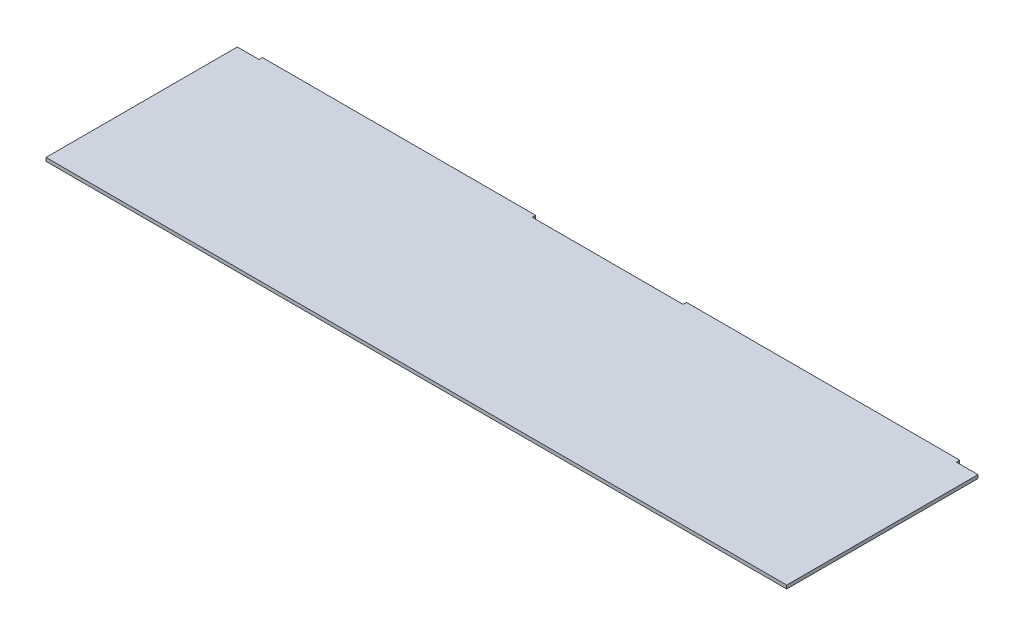
ISO-10303-21;
HEADER;
FILE_DESCRIPTION(('STEP AP214'),'2;1');
FILE_NAME('part.step','',(''),(''),'','','');
FILE_SCHEMA(('AUTOMOTIVE_DESIGN { 1 0 10303 214 1 1 1 1 }'));
ENDSEC;
DATA;
#1=APPLICATION_CONTEXT('core data for automotive mechanical design processes');
#2=APPLICATION_PROTOCOL_DEFINITION('international standard','automotive_design',2000,#1);
#3=PRODUCT_CONTEXT('',#1,'mechanical');
#4=PRODUCT('Part','Part','',(#3));
#5=PRODUCT_RELATED_PRODUCT_CATEGORY('part','',(#4));
#6=PRODUCT_DEFINITION_FORMATION('','',#4);
#7=PRODUCT_DEFINITION_CONTEXT('part definition',#1,'design');
#8=PRODUCT_DEFINITION('design','',#6,#7);
#9=PRODUCT_DEFINITION_SHAPE('','',#8);
#10=(LENGTH_UNIT() NAMED_UNIT(*) SI_UNIT(.MILLI.,.METRE.));
#11=(NAMED_UNIT(*) PLANE_ANGLE_UNIT() SI_UNIT($,.RADIAN.));
#12=(NAMED_UNIT(*) SI_UNIT($,.STERADIAN.) SOLID_ANGLE_UNIT());
#13=UNCERTAINTY_MEASURE_WITH_UNIT(LENGTH_MEASURE(1.E-05),#10,'distance_accuracy_value','');
#14=(GEOMETRIC_REPRESENTATION_CONTEXT(3) GLOBAL_UNCERTAINTY_ASSIGNED_CONTEXT((#13)) GLOBAL_UNIT_ASSIGNED_CONTEXT((#10,
#11,#12)) REPRESENTATION_CONTEXT('',''));
#15=CARTESIAN_POINT('',(0.,0.,0.));
#16=DIRECTION('',(0.,0.,1.));
#17=DIRECTION('',(1.,0.,0.));
#18=AXIS2_PLACEMENT_3D('',#15,#16,#17);
#19=CARTESIAN_POINT('',(-344.2208,1.5875,-88.9));
#20=DIRECTION('',(0.,0.,1.));
#21=DIRECTION('',(1.,0.,0.));
#22=AXIS2_PLACEMENT_3D('',#19,#20,#21);
#23=PLANE('',#22);
#24=DIRECTION('',(0.,1.,0.));
#25=VECTOR('',#24,1.);
#26=CARTESIAN_POINT('',(-324.0659,1.5875,-88.9));
#27=LINE('',#26,#25);
#28=CARTESIAN_POINT('',(-324.0659,-1.5875,-88.9));
#29=VERTEX_POINT('',#28);
#30=CARTESIAN_POINT('',(-324.0659,1.5875,-88.9));
#31=VERTEX_POINT('',#30);
#32=EDGE_CURVE('E145',#29,#31,#27,.T.);
#33=ORIENTED_EDGE('',*,*,#32,.F.);
#34=DIRECTION('',(-1.,0.,0.));
#35=VECTOR('',#34,1.);
#36=CARTESIAN_POINT('',(-344.2208,-1.5875,-88.9));
#37=LINE('',#36,#35);
#38=CARTESIAN_POINT('',(-344.2208,-1.5875,-88.9));
#39=VERTEX_POINT('',#38);
#40=EDGE_CURVE('E193',#29,#39,#37,.T.);
#41=ORIENTED_EDGE('',*,*,#40,.T.);
#42=DIRECTION('',(0.,-1.,0.));
#43=VECTOR('',#42,1.);
#44=CARTESIAN_POINT('',(-344.2208,1.5875,-88.9));
#45=LINE('',#44,#43);
#46=CARTESIAN_POINT('',(-344.2208,1.5875,-88.9));
#47=VERTEX_POINT('',#46);
#48=EDGE_CURVE('E41',#47,#39,#45,.T.);
#49=ORIENTED_EDGE('',*,*,#48,.F.);
#50=DIRECTION('',(-1.,0.,0.));
#51=VECTOR('',#50,1.);
#52=CARTESIAN_POINT('',(-344.2208,1.5875,-88.9));
#53=LINE('',#52,#51);
#54=EDGE_CURVE('E48',#31,#47,#53,.T.);
#55=ORIENTED_EDGE('',*,*,#54,.F.);
#56=EDGE_LOOP('',(#33,#41,#49,#55));
#57=FACE_BOUND('',#56,.T.);
#58=ADVANCED_FACE('F33',(#57),#23,.F.);
#59=DIRECTION('',(0.,-1.,0.));
#60=VECTOR('',#59,1.);
#61=CARTESIAN_POINT('',(-70.0658999999999,1.5875,-88.9));
#62=LINE('',#61,#60);
#63=CARTESIAN_POINT('',(-70.0658999999999,1.5875,-88.9));
#64=VERTEX_POINT('',#63);
#65=CARTESIAN_POINT('',(-70.0658999999999,-1.5875,-88.9));
#66=VERTEX_POINT('',#65);
#67=EDGE_CURVE('E56',#64,#66,#62,.T.);
#68=ORIENTED_EDGE('',*,*,#67,.F.);
#69=CARTESIAN_POINT('',(70.0658999999999,1.5875,-88.9));
#70=VERTEX_POINT('',#69);
#71=EDGE_CURVE('E186',#70,#64,#53,.T.);
#72=ORIENTED_EDGE('',*,*,#71,.F.);
#73=DIRECTION('',(0.,1.,0.));
#74=VECTOR('',#73,1.);
#75=CARTESIAN_POINT('',(70.0658999999999,1.5875,-88.9));
#76=LINE('',#75,#74);
#77=CARTESIAN_POINT('',(70.0658999999999,-1.5875,-88.9));
#78=VERTEX_POINT('',#77);
#79=EDGE_CURVE('E149',#78,#70,#76,.T.);
#80=ORIENTED_EDGE('',*,*,#79,.F.);
#81=EDGE_CURVE('E197',#78,#66,#37,.T.);
#82=ORIENTED_EDGE('',*,*,#81,.T.);
#83=EDGE_LOOP('',(#68,#72,#80,#82));
#84=FACE_BOUND('',#83,.T.);
#85=ADVANCED_FACE('F248',(#84),#23,.F.);
#86=DIRECTION('',(0.,-1.,0.));
#87=VECTOR('',#86,1.);
#88=CARTESIAN_POINT('',(324.0659,1.5875,-88.9));
#89=LINE('',#88,#87);
#90=CARTESIAN_POINT('',(324.0659,1.5875,-88.9));
#91=VERTEX_POINT('',#90);
#92=CARTESIAN_POINT('',(324.0659,-1.5875,-88.9));
#93=VERTEX_POINT('',#92);
#94=EDGE_CURVE('E146',#91,#93,#89,.T.);
#95=ORIENTED_EDGE('',*,*,#94,.F.);
#96=CARTESIAN_POINT('',(344.2208,1.5875,-88.9));
#97=VERTEX_POINT('',#96);
#98=EDGE_CURVE('E182',#97,#91,#53,.T.);
#99=ORIENTED_EDGE('',*,*,#98,.F.);
#100=DIRECTION('',(0.,-1.,0.));
#101=VECTOR('',#100,1.);
#102=CARTESIAN_POINT('',(344.2208,1.5875,-88.9));
#103=LINE('',#102,#101);
#104=CARTESIAN_POINT('',(344.2208,-1.5875,-88.9));
#105=VERTEX_POINT('',#104);
#106=EDGE_CURVE('E11',#97,#105,#103,.T.);
#107=ORIENTED_EDGE('',*,*,#106,.T.);
#108=EDGE_CURVE('E194',#105,#93,#37,.T.);
#109=ORIENTED_EDGE('',*,*,#108,.T.);
#110=EDGE_LOOP('',(#95,#99,#107,#109));
#111=FACE_BOUND('',#110,.T.);
#112=ADVANCED_FACE('F246',(#111),#23,.F.);
#113=CARTESIAN_POINT('',(344.2208,1.5875,-88.9));
#114=DIRECTION('',(-1.,0.,0.));
#115=DIRECTION('',(0.,0.,1.));
#116=AXIS2_PLACEMENT_3D('',#113,#114,#115);
#117=PLANE('',#116);
#118=DIRECTION('',(0.,0.,-1.));
#119=VECTOR('',#118,1.);
#120=CARTESIAN_POINT('',(344.2208,-1.5875,-88.9));
#121=LINE('',#120,#119);
#122=CARTESIAN_POINT('',(344.2208,-1.5875,88.9));
#123=VERTEX_POINT('',#122);
#124=EDGE_CURVE('E178',#123,#105,#121,.T.);
#125=ORIENTED_EDGE('',*,*,#124,.T.);
#126=ORIENTED_EDGE('',*,*,#106,.F.);
#127=DIRECTION('',(0.,0.,-1.));
#128=VECTOR('',#127,1.);
#129=CARTESIAN_POINT('',(344.2208,1.5875,-88.9));
#130=LINE('',#129,#128);
#131=CARTESIAN_POINT('',(344.2208,1.5875,88.9));
#132=VERTEX_POINT('',#131);
#133=EDGE_CURVE('E179',#132,#97,#130,.T.);
#134=ORIENTED_EDGE('',*,*,#133,.F.);
#135=DIRECTION('',(0.,-1.,0.));
#136=VECTOR('',#135,1.);
#137=CARTESIAN_POINT('',(344.2208,1.5875,88.9));
#138=LINE('',#137,#136);
#139=EDGE_CURVE('E190',#132,#123,#138,.T.);
#140=ORIENTED_EDGE('',*,*,#139,.T.);
#141=EDGE_LOOP('',(#125,#126,#134,#140));
#142=FACE_BOUND('',#141,.T.);
#143=ADVANCED_FACE('F35',(#142),#117,.F.);
#144=CARTESIAN_POINT('',(-344.2208,1.5875,-88.9));
#145=DIRECTION('',(1.,0.,0.));
#146=DIRECTION('',(0.,0.,-1.));
#147=AXIS2_PLACEMENT_3D('',#144,#145,#146);
#148=PLANE('',#147);
#149=DIRECTION('',(0.,0.,1.));
#150=VECTOR('',#149,1.);
#151=CARTESIAN_POINT('',(-344.2208,-1.5875,-88.9));
#152=LINE('',#151,#150);
#153=CARTESIAN_POINT('',(-344.2208,-1.5875,88.9));
#154=VERTEX_POINT('',#153);
#155=EDGE_CURVE('E196',#39,#154,#152,.T.);
#156=ORIENTED_EDGE('',*,*,#155,.T.);
#157=DIRECTION('',(0.,-1.,0.));
#158=VECTOR('',#157,1.);
#159=CARTESIAN_POINT('',(-344.2208,1.5875,88.9));
#160=LINE('',#159,#158);
#161=CARTESIAN_POINT('',(-344.2208,1.5875,88.9));
#162=VERTEX_POINT('',#161);
#163=EDGE_CURVE('E202',#162,#154,#160,.T.);
#164=ORIENTED_EDGE('',*,*,#163,.F.);
#165=DIRECTION('',(0.,0.,1.));
#166=VECTOR('',#165,1.);
#167=CARTESIAN_POINT('',(-344.2208,1.5875,-88.9));
#168=LINE('',#167,#166);
#169=EDGE_CURVE('E185',#47,#162,#168,.T.);
#170=ORIENTED_EDGE('',*,*,#169,.F.);
#171=ORIENTED_EDGE('',*,*,#48,.T.);
#172=EDGE_LOOP('',(#156,#164,#170,#171));
#173=FACE_BOUND('',#172,.T.);
#174=ADVANCED_FACE('F208',(#173),#148,.F.);
#175=CARTESIAN_POINT('',(-344.2208,1.5875,88.9));
#176=DIRECTION('',(0.,0.,-1.));
#177=DIRECTION('',(-1.,0.,0.));
#178=AXIS2_PLACEMENT_3D('',#175,#176,#177);
#179=PLANE('',#178);
#180=DIRECTION('',(1.,0.,0.));
#181=VECTOR('',#180,1.);
#182=CARTESIAN_POINT('',(-344.2208,-1.5875,88.9));
#183=LINE('',#182,#181);
#184=EDGE_CURVE('E181',#154,#123,#183,.T.);
#185=ORIENTED_EDGE('',*,*,#184,.T.);
#186=ORIENTED_EDGE('',*,*,#139,.F.);
#187=DIRECTION('',(1.,0.,0.));
#188=VECTOR('',#187,1.);
#189=CARTESIAN_POINT('',(-344.2208,1.5875,88.9));
#190=LINE('',#189,#188);
#191=EDGE_CURVE('E188',#162,#132,#190,.T.);
#192=ORIENTED_EDGE('',*,*,#191,.F.);
#193=ORIENTED_EDGE('',*,*,#163,.T.);
#194=EDGE_LOOP('',(#185,#186,#192,#193));
#195=FACE_BOUND('',#194,.T.);
#196=ADVANCED_FACE('F216',(#195),#179,.F.);
#197=CARTESIAN_POINT('',(0.,1.5875,0.));
#198=DIRECTION('',(0.,1.,0.));
#199=DIRECTION('',(0.,0.,1.));
#200=AXIS2_PLACEMENT_3D('',#197,#198,#199);
#201=PLANE('',#200);
#202=ORIENTED_EDGE('',*,*,#133,.T.);
#203=ORIENTED_EDGE('',*,*,#98,.T.);
#204=DIRECTION('',(0.,0.,1.));
#205=VECTOR('',#204,1.);
#206=CARTESIAN_POINT('',(324.0659,1.5875,-92.075));
#207=LINE('',#206,#205);
#208=CARTESIAN_POINT('',(324.0659,1.5875,-92.075));
#209=VERTEX_POINT('',#208);
#210=EDGE_CURVE('E163',#209,#91,#207,.T.);
#211=ORIENTED_EDGE('',*,*,#210,.F.);
#212=DIRECTION('',(1.,0.,0.));
#213=VECTOR('',#212,1.);
#214=CARTESIAN_POINT('',(324.0659,1.5875,-92.075));
#215=LINE('',#214,#213);
#216=CARTESIAN_POINT('',(70.0658999999999,1.5875,-92.075));
#217=VERTEX_POINT('',#216);
#218=EDGE_CURVE('E162',#217,#209,#215,.T.);
#219=ORIENTED_EDGE('',*,*,#218,.F.);
#220=DIRECTION('',(0.,0.,1.));
#221=VECTOR('',#220,1.);
#222=CARTESIAN_POINT('',(70.0658999999999,1.5875,-92.075));
#223=LINE('',#222,#221);
#224=EDGE_CURVE('E169',#217,#70,#223,.T.);
#225=ORIENTED_EDGE('',*,*,#224,.T.);
#226=ORIENTED_EDGE('',*,*,#71,.T.);
#227=DIRECTION('',(0.,0.,1.));
#228=VECTOR('',#227,1.);
#229=CARTESIAN_POINT('',(-70.0658999999999,1.5875,-92.075));
#230=LINE('',#229,#228);
#231=CARTESIAN_POINT('',(-70.0658999999999,1.5875,-92.075));
#232=VERTEX_POINT('',#231);
#233=EDGE_CURVE('E130',#232,#64,#230,.T.);
#234=ORIENTED_EDGE('',*,*,#233,.F.);
#235=DIRECTION('',(1.,0.,0.));
#236=VECTOR('',#235,1.);
#237=CARTESIAN_POINT('',(-324.0659,1.5875,-92.075));
#238=LINE('',#237,#236);
#239=CARTESIAN_POINT('',(-324.0659,1.5875,-92.075));
#240=VERTEX_POINT('',#239);
#241=EDGE_CURVE('E122',#240,#232,#238,.T.);
#242=ORIENTED_EDGE('',*,*,#241,.F.);
#243=DIRECTION('',(0.,0.,1.));
#244=VECTOR('',#243,1.);
#245=CARTESIAN_POINT('',(-324.0659,1.5875,-92.075));
#246=LINE('',#245,#244);
#247=EDGE_CURVE('E127',#240,#31,#246,.T.);
#248=ORIENTED_EDGE('',*,*,#247,.T.);
#249=ORIENTED_EDGE('',*,*,#54,.T.);
#250=ORIENTED_EDGE('',*,*,#169,.T.);
#251=ORIENTED_EDGE('',*,*,#191,.T.);
#252=EDGE_LOOP('',(#202,#203,#211,#219,#225,#226,#234,#242,#248,#249,#250,#251));
#253=FACE_BOUND('',#252,.T.);
#254=ADVANCED_FACE('F125',(#253),#201,.T.);
#255=CARTESIAN_POINT('',(0.,-1.5875,0.));
#256=DIRECTION('',(0.,1.,0.));
#257=DIRECTION('',(0.,0.,1.));
#258=AXIS2_PLACEMENT_3D('',#255,#256,#257);
#259=PLANE('',#258);
#260=ORIENTED_EDGE('',*,*,#124,.F.);
#261=ORIENTED_EDGE('',*,*,#184,.F.);
#262=ORIENTED_EDGE('',*,*,#155,.F.);
#263=ORIENTED_EDGE('',*,*,#40,.F.);
#264=DIRECTION('',(0.,0.,1.));
#265=VECTOR('',#264,1.);
#266=CARTESIAN_POINT('',(-324.0659,-1.5875,-92.075));
#267=LINE('',#266,#265);
#268=CARTESIAN_POINT('',(-324.0659,-1.5875,-92.075));
#269=VERTEX_POINT('',#268);
#270=EDGE_CURVE('E229',#269,#29,#267,.T.);
#271=ORIENTED_EDGE('',*,*,#270,.F.);
#272=DIRECTION('',(-1.,0.,0.));
#273=VECTOR('',#272,1.);
#274=CARTESIAN_POINT('',(-324.0659,-1.5875,-92.075));
#275=LINE('',#274,#273);
#276=CARTESIAN_POINT('',(-70.0658999999999,-1.5875,-92.075));
#277=VERTEX_POINT('',#276);
#278=EDGE_CURVE('E139',#277,#269,#275,.T.);
#279=ORIENTED_EDGE('',*,*,#278,.F.);
#280=DIRECTION('',(0.,0.,1.));
#281=VECTOR('',#280,1.);
#282=CARTESIAN_POINT('',(-70.0658999999999,-1.5875,-92.075));
#283=LINE('',#282,#281);
#284=EDGE_CURVE('E151',#277,#66,#283,.T.);
#285=ORIENTED_EDGE('',*,*,#284,.T.);
#286=ORIENTED_EDGE('',*,*,#81,.F.);
#287=DIRECTION('',(0.,0.,1.));
#288=VECTOR('',#287,1.);
#289=CARTESIAN_POINT('',(70.0658999999999,-1.5875,-92.075));
#290=LINE('',#289,#288);
#291=CARTESIAN_POINT('',(70.0658999999999,-1.5875,-92.075));
#292=VERTEX_POINT('',#291);
#293=EDGE_CURVE('E172',#292,#78,#290,.T.);
#294=ORIENTED_EDGE('',*,*,#293,.F.);
#295=DIRECTION('',(-1.,0.,0.));
#296=VECTOR('',#295,1.);
#297=CARTESIAN_POINT('',(324.0659,-1.5875,-92.075));
#298=LINE('',#297,#296);
#299=CARTESIAN_POINT('',(324.0659,-1.5875,-92.075));
#300=VERTEX_POINT('',#299);
#301=EDGE_CURVE('E158',#300,#292,#298,.T.);
#302=ORIENTED_EDGE('',*,*,#301,.F.);
#303=DIRECTION('',(0.,0.,1.));
#304=VECTOR('',#303,1.);
#305=CARTESIAN_POINT('',(324.0659,-1.5875,-92.075));
#306=LINE('',#305,#304);
#307=EDGE_CURVE('E175',#300,#93,#306,.T.);
#308=ORIENTED_EDGE('',*,*,#307,.T.);
#309=ORIENTED_EDGE('',*,*,#108,.F.);
#310=EDGE_LOOP('',(#260,#261,#262,#263,#271,#279,#285,#286,#294,#302,#308,#309));
#311=FACE_BOUND('',#310,.T.);
#312=ADVANCED_FACE('F213',(#311),#259,.F.);
#313=CARTESIAN_POINT('',(324.0659,1.5875,-92.075));
#314=DIRECTION('',(-1.,0.,0.));
#315=DIRECTION('',(0.,0.,1.));
#316=AXIS2_PLACEMENT_3D('',#313,#314,#315);
#317=PLANE('',#316);
#318=ORIENTED_EDGE('',*,*,#94,.T.);
#319=ORIENTED_EDGE('',*,*,#307,.F.);
#320=DIRECTION('',(0.,-1.,0.));
#321=VECTOR('',#320,1.);
#322=CARTESIAN_POINT('',(324.0659,1.5875,-92.075));
#323=LINE('',#322,#321);
#324=EDGE_CURVE('E155',#209,#300,#323,.T.);
#325=ORIENTED_EDGE('',*,*,#324,.F.);
#326=ORIENTED_EDGE('',*,*,#210,.T.);
#327=EDGE_LOOP('',(#318,#319,#325,#326));
#328=FACE_BOUND('',#327,.T.);
#329=ADVANCED_FACE('F244',(#328),#317,.F.);
#330=CARTESIAN_POINT('',(70.0658999999999,1.5875,-92.075));
#331=DIRECTION('',(1.,0.,0.));
#332=DIRECTION('',(0.,0.,-1.));
#333=AXIS2_PLACEMENT_3D('',#330,#331,#332);
#334=PLANE('',#333);
#335=ORIENTED_EDGE('',*,*,#79,.T.);
#336=ORIENTED_EDGE('',*,*,#224,.F.);
#337=DIRECTION('',(0.,1.,0.));
#338=VECTOR('',#337,1.);
#339=CARTESIAN_POINT('',(70.0658999999999,1.5875,-92.075));
#340=LINE('',#339,#338);
#341=EDGE_CURVE('E160',#292,#217,#340,.T.);
#342=ORIENTED_EDGE('',*,*,#341,.F.);
#343=ORIENTED_EDGE('',*,*,#293,.T.);
#344=EDGE_LOOP('',(#335,#336,#342,#343));
#345=FACE_BOUND('',#344,.T.);
#346=ADVANCED_FACE('F238',(#345),#334,.F.);
#347=CARTESIAN_POINT('',(0.,0.,-92.075));
#348=DIRECTION('',(0.,0.,-1.));
#349=DIRECTION('',(-1.,0.,0.));
#350=AXIS2_PLACEMENT_3D('',#347,#348,#349);
#351=PLANE('',#350);
#352=ORIENTED_EDGE('',*,*,#324,.T.);
#353=ORIENTED_EDGE('',*,*,#301,.T.);
#354=ORIENTED_EDGE('',*,*,#341,.T.);
#355=ORIENTED_EDGE('',*,*,#218,.T.);
#356=EDGE_LOOP('',(#352,#353,#354,#355));
#357=FACE_BOUND('',#356,.T.);
#358=ADVANCED_FACE('F240',(#357),#351,.T.);
#359=CARTESIAN_POINT('',(-324.0659,1.5875,-92.075));
#360=DIRECTION('',(1.,0.,0.));
#361=DIRECTION('',(0.,0.,-1.));
#362=AXIS2_PLACEMENT_3D('',#359,#360,#361);
#363=PLANE('',#362);
#364=ORIENTED_EDGE('',*,*,#32,.T.);
#365=ORIENTED_EDGE('',*,*,#247,.F.);
#366=DIRECTION('',(0.,1.,0.));
#367=VECTOR('',#366,1.);
#368=CARTESIAN_POINT('',(-324.0659,1.5875,-92.075));
#369=LINE('',#368,#367);
#370=EDGE_CURVE('E134',#269,#240,#369,.T.);
#371=ORIENTED_EDGE('',*,*,#370,.F.);
#372=ORIENTED_EDGE('',*,*,#270,.T.);
#373=EDGE_LOOP('',(#364,#365,#371,#372));
#374=FACE_BOUND('',#373,.T.);
#375=ADVANCED_FACE('F144',(#374),#363,.F.);
#376=CARTESIAN_POINT('',(-70.0658999999999,1.5875,-92.075));
#377=DIRECTION('',(-1.,0.,0.));
#378=DIRECTION('',(0.,0.,1.));
#379=AXIS2_PLACEMENT_3D('',#376,#377,#378);
#380=PLANE('',#379);
#381=ORIENTED_EDGE('',*,*,#67,.T.);
#382=ORIENTED_EDGE('',*,*,#284,.F.);
#383=DIRECTION('',(0.,-1.,0.));
#384=VECTOR('',#383,1.);
#385=CARTESIAN_POINT('',(-70.0658999999999,1.5875,-92.075));
#386=LINE('',#385,#384);
#387=EDGE_CURVE('E133',#232,#277,#386,.T.);
#388=ORIENTED_EDGE('',*,*,#387,.F.);
#389=ORIENTED_EDGE('',*,*,#233,.T.);
#390=EDGE_LOOP('',(#381,#382,#388,#389));
#391=FACE_BOUND('',#390,.T.);
#392=ADVANCED_FACE('F225',(#391),#380,.F.);
#393=CARTESIAN_POINT('',(0.,0.,-92.075));
#394=DIRECTION('',(0.,0.,1.));
#395=DIRECTION('',(1.,0.,0.));
#396=AXIS2_PLACEMENT_3D('',#393,#394,#395);
#397=PLANE('',#396);
#398=ORIENTED_EDGE('',*,*,#370,.T.);
#399=ORIENTED_EDGE('',*,*,#241,.T.);
#400=ORIENTED_EDGE('',*,*,#387,.T.);
#401=ORIENTED_EDGE('',*,*,#278,.T.);
#402=EDGE_LOOP('',(#398,#399,#400,#401));
#403=FACE_BOUND('',#402,.T.);
#404=ADVANCED_FACE('F137',(#403),#397,.F.);
#405=CLOSED_SHELL('',(#58,#85,#112,#143,#174,#196,#254,#312,#329,#346,#358,#375,#392,#404));
#406=MANIFOLD_SOLID_BREP('B2',#405);
#407=ADVANCED_BREP_SHAPE_REPRESENTATION('',(#18,#406),#14);
#408=SHAPE_DEFINITION_REPRESENTATION(#9,#407);
ENDSEC;
END-ISO-10303-21;
